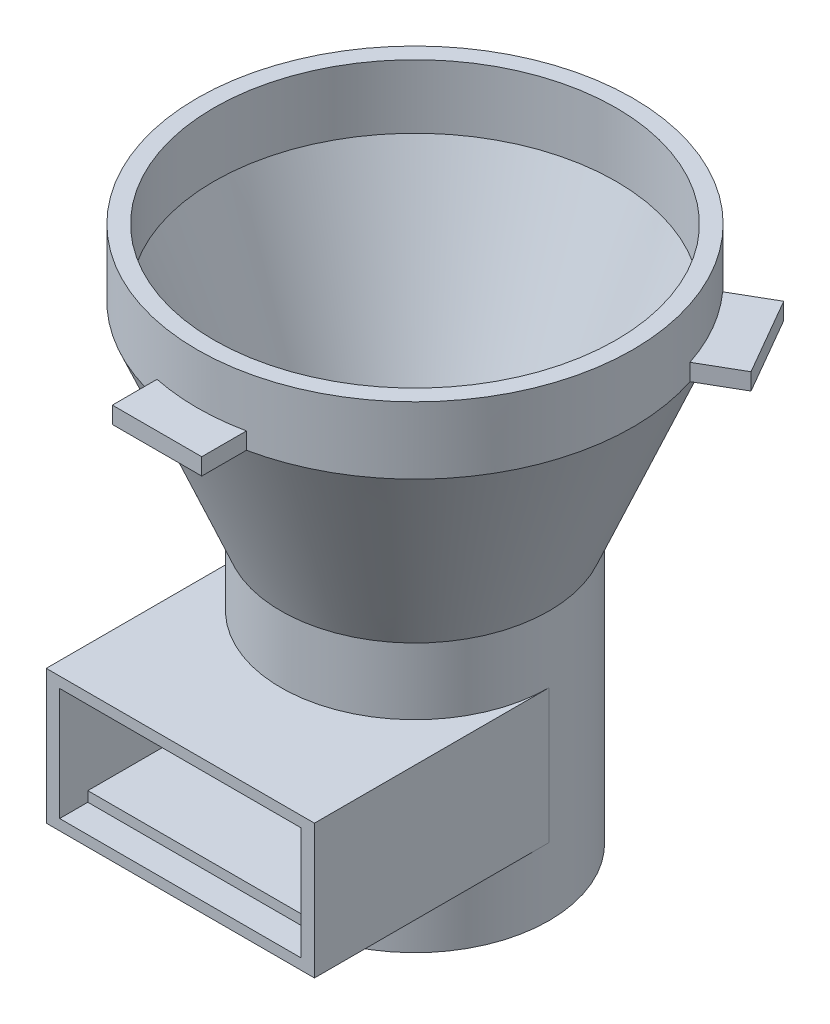
ISO-10303-21;
HEADER;
FILE_DESCRIPTION(('STEP AP214'),'2;1');
FILE_NAME('part.step','',(''),(''),'','','');
FILE_SCHEMA(('AUTOMOTIVE_DESIGN { 1 0 10303 214 1 1 1 1 }'));
ENDSEC;
DATA;
#1=APPLICATION_CONTEXT('core data for automotive mechanical design processes');
#2=APPLICATION_PROTOCOL_DEFINITION('international standard','automotive_design',2000,#1);
#3=PRODUCT_CONTEXT('',#1,'mechanical');
#4=PRODUCT('Part','Part','',(#3));
#5=PRODUCT_RELATED_PRODUCT_CATEGORY('part','',(#4));
#6=PRODUCT_DEFINITION_FORMATION('','',#4);
#7=PRODUCT_DEFINITION_CONTEXT('part definition',#1,'design');
#8=PRODUCT_DEFINITION('design','',#6,#7);
#9=PRODUCT_DEFINITION_SHAPE('','',#8);
#10=(LENGTH_UNIT() NAMED_UNIT(*) SI_UNIT(.MILLI.,.METRE.));
#11=(NAMED_UNIT(*) PLANE_ANGLE_UNIT() SI_UNIT($,.RADIAN.));
#12=(NAMED_UNIT(*) SI_UNIT($,.STERADIAN.) SOLID_ANGLE_UNIT());
#13=UNCERTAINTY_MEASURE_WITH_UNIT(LENGTH_MEASURE(1.E-05),#10,'distance_accuracy_value','');
#14=(GEOMETRIC_REPRESENTATION_CONTEXT(3) GLOBAL_UNCERTAINTY_ASSIGNED_CONTEXT((#13)) GLOBAL_UNIT_ASSIGNED_CONTEXT((#10,
#11,#12)) REPRESENTATION_CONTEXT('',''));
#15=CARTESIAN_POINT('',(0.,0.,0.));
#16=DIRECTION('',(0.,0.,1.));
#17=DIRECTION('',(1.,0.,0.));
#18=AXIS2_PLACEMENT_3D('',#15,#16,#17);
#19=CARTESIAN_POINT('',(0.,92.075,0.));
#20=DIRECTION('',(0.,-1.,0.));
#21=DIRECTION('',(1.,0.,0.));
#22=AXIS2_PLACEMENT_3D('',#19,#20,#21);
#23=PLANE('',#22);
#24=CARTESIAN_POINT('',(0.,92.075,0.));
#25=DIRECTION('',(0.,1.,0.));
#26=DIRECTION('',(-1.,0.,0.));
#27=AXIS2_PLACEMENT_3D('',#24,#25,#26);
#28=CIRCLE('',#27,41.275);
#29=CARTESIAN_POINT('',(-8.46666666666669,92.075,40.3972917477837));
#30=VERTEX_POINT('',#29);
#31=CARTESIAN_POINT('',(8.46666666666665,92.075,40.3972917477837));
#32=VERTEX_POINT('',#31);
#33=EDGE_CURVE('E54',#30,#32,#28,.T.);
#34=ORIENTED_EDGE('',*,*,#33,.F.);
#35=DIRECTION('',(0.,0.,1.));
#36=VECTOR('',#35,1.);
#37=CARTESIAN_POINT('',(-8.46666666666669,92.075,48.8639584144504));
#38=LINE('',#37,#36);
#39=CARTESIAN_POINT('',(-8.46666666666669,92.075,48.8639584144504));
#40=VERTEX_POINT('',#39);
#41=EDGE_CURVE('E208',#30,#40,#38,.T.);
#42=ORIENTED_EDGE('',*,*,#41,.T.);
#43=DIRECTION('',(1.,0.,0.));
#44=VECTOR('',#43,1.);
#45=CARTESIAN_POINT('',(0.,92.075,48.8639584144504));
#46=LINE('',#45,#44);
#47=CARTESIAN_POINT('',(8.46666666666665,92.075,48.8639584144504));
#48=VERTEX_POINT('',#47);
#49=EDGE_CURVE('E228',#40,#48,#46,.T.);
#50=ORIENTED_EDGE('',*,*,#49,.T.);
#51=DIRECTION('',(0.,0.,-1.));
#52=VECTOR('',#51,1.);
#53=CARTESIAN_POINT('',(8.46666666666665,92.075,48.8639584144504));
#54=LINE('',#53,#52);
#55=EDGE_CURVE('E211',#48,#32,#54,.T.);
#56=ORIENTED_EDGE('',*,*,#55,.T.);
#57=EDGE_LOOP('',(#34,#42,#50,#56));
#58=FACE_BOUND('',#57,.T.);
#59=ADVANCED_FACE('F43',(#58),#23,.F.);
#60=CARTESIAN_POINT('',(39.2184142310056,92.075,-12.8662974551833));
#61=VERTEX_POINT('',#60);
#62=CARTESIAN_POINT('',(30.7517475643391,92.075,-27.5309942925998));
#63=VERTEX_POINT('',#62);
#64=EDGE_CURVE('E11',#61,#63,#28,.T.);
#65=ORIENTED_EDGE('',*,*,#64,.F.);
#66=DIRECTION('',(0.866025403784443,0.,-0.499999999999992));
#67=VECTOR('',#66,1.);
#68=CARTESIAN_POINT('',(46.5507626497139,92.075,-17.0996307885165));
#69=LINE('',#68,#67);
#70=CARTESIAN_POINT('',(46.5507626497139,92.075,-17.0996307885165));
#71=VERTEX_POINT('',#70);
#72=EDGE_CURVE('E425',#61,#71,#69,.T.);
#73=ORIENTED_EDGE('',*,*,#72,.T.);
#74=DIRECTION('',(-0.499999999999992,0.,-0.866025403784443));
#75=VECTOR('',#74,1.);
#76=CARTESIAN_POINT('',(42.3174293163806,92.075,-24.4319792072248));
#77=LINE('',#76,#75);
#78=CARTESIAN_POINT('',(38.0840959830474,92.075,-31.7643276259331));
#79=VERTEX_POINT('',#78);
#80=EDGE_CURVE('E409',#71,#79,#77,.T.);
#81=ORIENTED_EDGE('',*,*,#80,.T.);
#82=DIRECTION('',(-0.866025403784443,0.,0.499999999999992));
#83=VECTOR('',#82,1.);
#84=CARTESIAN_POINT('',(38.0840959830474,92.075,-31.7643276259331));
#85=LINE('',#84,#83);
#86=EDGE_CURVE('E403',#79,#63,#85,.T.);
#87=ORIENTED_EDGE('',*,*,#86,.T.);
#88=EDGE_LOOP('',(#65,#73,#81,#87));
#89=FACE_BOUND('',#88,.T.);
#90=ADVANCED_FACE('F520',(#89),#23,.F.);
#91=CARTESIAN_POINT('',(-30.7517475643387,92.075,-27.5309942926003));
#92=VERTEX_POINT('',#91);
#93=CARTESIAN_POINT('',(-39.2184142310055,92.075,-12.8662974551838));
#94=VERTEX_POINT('',#93);
#95=EDGE_CURVE('E52',#92,#94,#28,.T.);
#96=ORIENTED_EDGE('',*,*,#95,.F.);
#97=DIRECTION('',(-0.866025403784436,0.,-0.500000000000004));
#98=VECTOR('',#97,1.);
#99=CARTESIAN_POINT('',(-38.084095983047,92.075,-31.7643276259336));
#100=LINE('',#99,#98);
#101=CARTESIAN_POINT('',(-38.084095983047,92.075,-31.7643276259336));
#102=VERTEX_POINT('',#101);
#103=EDGE_CURVE('E467',#92,#102,#100,.T.);
#104=ORIENTED_EDGE('',*,*,#103,.T.);
#105=DIRECTION('',(-0.500000000000004,0.,0.866025403784436));
#106=VECTOR('',#105,1.);
#107=CARTESIAN_POINT('',(-42.3174293163803,92.075,-24.4319792072254));
#108=LINE('',#107,#106);
#109=CARTESIAN_POINT('',(-46.5507626497137,92.075,-17.0996307885172));
#110=VERTEX_POINT('',#109);
#111=EDGE_CURVE('E451',#102,#110,#108,.T.);
#112=ORIENTED_EDGE('',*,*,#111,.T.);
#113=DIRECTION('',(0.866025403784436,0.,0.500000000000004));
#114=VECTOR('',#113,1.);
#115=CARTESIAN_POINT('',(-46.5507626497137,92.075,-17.0996307885172));
#116=LINE('',#115,#114);
#117=EDGE_CURVE('E434',#110,#94,#116,.T.);
#118=ORIENTED_EDGE('',*,*,#117,.T.);
#119=EDGE_LOOP('',(#96,#104,#112,#118));
#120=FACE_BOUND('',#119,.T.);
#121=ADVANCED_FACE('F540',(#120),#23,.F.);
#122=CARTESIAN_POINT('',(22.86,14.8525001339576,3.68300000000003));
#123=DIRECTION('',(1.,0.,0.));
#124=DIRECTION('',(0.,0.,-1.));
#125=AXIS2_PLACEMENT_3D('',#122,#123,#124);
#126=PLANE('',#125);
#127=DIRECTION('',(0.,0.,1.));
#128=VECTOR('',#127,1.);
#129=CARTESIAN_POINT('',(22.86,16.7575001339576,3.68300000000003));
#130=LINE('',#129,#128);
#131=CARTESIAN_POINT('',(22.86,16.7575001339576,3.68300000000003));
#132=VERTEX_POINT('',#131);
#133=CARTESIAN_POINT('',(22.86,16.7575001339576,39.1163527750558));
#134=VERTEX_POINT('',#133);
#135=EDGE_CURVE('E316',#132,#134,#130,.T.);
#136=ORIENTED_EDGE('',*,*,#135,.T.);
#137=DIRECTION('',(0.,1.,0.));
#138=VECTOR('',#137,1.);
#139=CARTESIAN_POINT('',(22.86,16.7575001339576,39.1163527750558));
#140=LINE('',#139,#138);
#141=CARTESIAN_POINT('',(22.86,14.8525001339576,39.1163527750558));
#142=VERTEX_POINT('',#141);
#143=EDGE_CURVE('E299',#142,#134,#140,.T.);
#144=ORIENTED_EDGE('',*,*,#143,.F.);
#145=DIRECTION('',(0.,0.,1.));
#146=VECTOR('',#145,1.);
#147=CARTESIAN_POINT('',(22.86,14.8525001339576,3.68300000000003));
#148=LINE('',#147,#146);
#149=CARTESIAN_POINT('',(22.86,14.8525001339576,44.45));
#150=VERTEX_POINT('',#149);
#151=EDGE_CURVE('E344',#142,#150,#148,.T.);
#152=ORIENTED_EDGE('',*,*,#151,.T.);
#153=DIRECTION('',(0.,1.,0.));
#154=VECTOR('',#153,1.);
#155=CARTESIAN_POINT('',(22.86,14.8525001339576,44.45));
#156=LINE('',#155,#154);
#157=CARTESIAN_POINT('',(22.86,36.1885001339576,44.45));
#158=VERTEX_POINT('',#157);
#159=EDGE_CURVE('E69',#150,#158,#156,.T.);
#160=ORIENTED_EDGE('',*,*,#159,.T.);
#161=DIRECTION('',(0.,0.,1.));
#162=VECTOR('',#161,1.);
#163=CARTESIAN_POINT('',(22.86,36.1885001339576,3.68300000000003));
#164=LINE('',#163,#162);
#165=CARTESIAN_POINT('',(22.86,36.1885001339576,3.68300000000003));
#166=VERTEX_POINT('',#165);
#167=EDGE_CURVE('E330',#166,#158,#164,.T.);
#168=ORIENTED_EDGE('',*,*,#167,.F.);
#169=DIRECTION('',(0.,1.,0.));
#170=VECTOR('',#169,1.);
#171=CARTESIAN_POINT('',(22.86,14.8525001339576,3.68300000000003));
#172=LINE('',#171,#170);
#173=EDGE_CURVE('E319',#132,#166,#172,.T.);
#174=ORIENTED_EDGE('',*,*,#173,.F.);
#175=EDGE_LOOP('',(#136,#144,#152,#160,#168,#174));
#176=FACE_BOUND('',#175,.T.);
#177=ADVANCED_FACE('F545',(#176),#126,.F.);
#178=CARTESIAN_POINT('',(-22.86,14.8525001339576,3.68300000000003));
#179=DIRECTION('',(-1.,0.,0.));
#180=DIRECTION('',(0.,0.,1.));
#181=AXIS2_PLACEMENT_3D('',#178,#179,#180);
#182=PLANE('',#181);
#183=DIRECTION('',(0.,-1.,0.));
#184=VECTOR('',#183,1.);
#185=CARTESIAN_POINT('',(-22.86,16.7575001339576,39.1163527750558));
#186=LINE('',#185,#184);
#187=CARTESIAN_POINT('',(-22.86,16.7575001339576,39.1163527750558));
#188=VERTEX_POINT('',#187);
#189=CARTESIAN_POINT('',(-22.86,14.8525001339576,39.1163527750558));
#190=VERTEX_POINT('',#189);
#191=EDGE_CURVE('E293',#188,#190,#186,.T.);
#192=ORIENTED_EDGE('',*,*,#191,.F.);
#193=DIRECTION('',(0.,0.,-1.));
#194=VECTOR('',#193,1.);
#195=CARTESIAN_POINT('',(-22.86,16.7575001339576,3.68300000000003));
#196=LINE('',#195,#194);
#197=CARTESIAN_POINT('',(-22.86,16.7575001339576,3.68300000000003));
#198=VERTEX_POINT('',#197);
#199=EDGE_CURVE('E312',#188,#198,#196,.T.);
#200=ORIENTED_EDGE('',*,*,#199,.T.);
#201=DIRECTION('',(0.,-1.,0.));
#202=VECTOR('',#201,1.);
#203=CARTESIAN_POINT('',(-22.86,14.8525001339576,3.68300000000003));
#204=LINE('',#203,#202);
#205=CARTESIAN_POINT('',(-22.86,36.1885001339576,3.68300000000003));
#206=VERTEX_POINT('',#205);
#207=EDGE_CURVE('E327',#206,#198,#204,.T.);
#208=ORIENTED_EDGE('',*,*,#207,.F.);
#209=DIRECTION('',(0.,0.,1.));
#210=VECTOR('',#209,1.);
#211=CARTESIAN_POINT('',(-22.86,36.1885001339576,3.68300000000003));
#212=LINE('',#211,#210);
#213=CARTESIAN_POINT('',(-22.86,36.1885001339576,44.45));
#214=VERTEX_POINT('',#213);
#215=EDGE_CURVE('E351',#206,#214,#212,.T.);
#216=ORIENTED_EDGE('',*,*,#215,.T.);
#217=DIRECTION('',(0.,-1.,0.));
#218=VECTOR('',#217,1.);
#219=CARTESIAN_POINT('',(-22.86,14.8525001339576,44.45));
#220=LINE('',#219,#218);
#221=CARTESIAN_POINT('',(-22.86,14.8525001339576,44.45));
#222=VERTEX_POINT('',#221);
#223=EDGE_CURVE('E337',#214,#222,#220,.T.);
#224=ORIENTED_EDGE('',*,*,#223,.T.);
#225=DIRECTION('',(0.,0.,1.));
#226=VECTOR('',#225,1.);
#227=CARTESIAN_POINT('',(-22.86,14.8525001339576,3.68300000000003));
#228=LINE('',#227,#226);
#229=EDGE_CURVE('E348',#190,#222,#228,.T.);
#230=ORIENTED_EDGE('',*,*,#229,.F.);
#231=EDGE_LOOP('',(#192,#200,#208,#216,#224,#230));
#232=FACE_BOUND('',#231,.T.);
#233=ADVANCED_FACE('F550',(#232),#182,.F.);
#234=CARTESIAN_POINT('',(-22.86,14.8525001339576,3.68300000000003));
#235=DIRECTION('',(0.,-1.,0.));
#236=DIRECTION('',(0.,0.,-1.));
#237=AXIS2_PLACEMENT_3D('',#234,#235,#236);
#238=PLANE('',#237);
#239=ORIENTED_EDGE('',*,*,#151,.F.);
#240=DIRECTION('',(1.,0.,0.));
#241=VECTOR('',#240,1.);
#242=CARTESIAN_POINT('',(-22.86,14.8525001339576,39.1163527750558));
#243=LINE('',#242,#241);
#244=EDGE_CURVE('E296',#190,#142,#243,.T.);
#245=ORIENTED_EDGE('',*,*,#244,.F.);
#246=ORIENTED_EDGE('',*,*,#229,.T.);
#247=DIRECTION('',(1.,0.,0.));
#248=VECTOR('',#247,1.);
#249=CARTESIAN_POINT('',(-22.86,14.8525001339576,44.45));
#250=LINE('',#249,#248);
#251=EDGE_CURVE('E323',#222,#150,#250,.T.);
#252=ORIENTED_EDGE('',*,*,#251,.T.);
#253=EDGE_LOOP('',(#239,#245,#246,#252));
#254=FACE_BOUND('',#253,.T.);
#255=ADVANCED_FACE('F601',(#254),#238,.F.);
#256=CARTESIAN_POINT('',(0.,0.,0.));
#257=DIRECTION('',(0.,-1.,0.));
#258=DIRECTION('',(1.,0.,0.));
#259=AXIS2_PLACEMENT_3D('',#256,#257,#258);
#260=CYLINDRICAL_SURFACE('',#259,25.4);
#261=CARTESIAN_POINT('',(0.,50.8,0.));
#262=DIRECTION('',(0.,-1.,0.));
#263=DIRECTION('',(1.,0.,0.));
#264=AXIS2_PLACEMENT_3D('',#261,#262,#263);
#265=CIRCLE('',#264,25.4);
#266=CARTESIAN_POINT('',(25.4,50.8,0.));
#267=VERTEX_POINT('',#266);
#268=EDGE_CURVE('E266',#267,#267,#265,.T.);
#269=ORIENTED_EDGE('',*,*,#268,.T.);
#270=EDGE_LOOP('',(#269));
#271=FACE_BOUND('',#270,.T.);
#272=CARTESIAN_POINT('',(0.,0.,0.));
#273=DIRECTION('',(0.,-1.,0.));
#274=DIRECTION('',(1.,0.,0.));
#275=AXIS2_PLACEMENT_3D('',#272,#273,#274);
#276=CIRCLE('',#275,25.4);
#277=CARTESIAN_POINT('',(25.4,0.,0.));
#278=VERTEX_POINT('',#277);
#279=EDGE_CURVE('E255',#278,#278,#276,.T.);
#280=ORIENTED_EDGE('',*,*,#279,.F.);
#281=EDGE_LOOP('',(#280));
#282=FACE_BOUND('',#281,.T.);
#283=CARTESIAN_POINT('',(0.,12.8205001339576,0.));
#284=DIRECTION('',(0.,1.,0.));
#285=DIRECTION('',(0.,0.,1.));
#286=AXIS2_PLACEMENT_3D('',#283,#284,#285);
#287=CIRCLE('',#286,25.4);
#288=CARTESIAN_POINT('',(-25.4,12.8205001339576,0.));
#289=VERTEX_POINT('',#288);
#290=CARTESIAN_POINT('',(25.4,12.8205001339576,0.));
#291=VERTEX_POINT('',#290);
#292=EDGE_CURVE('E399',#289,#291,#287,.T.);
#293=ORIENTED_EDGE('',*,*,#292,.F.);
#294=DIRECTION('',(0.,-1.,0.));
#295=VECTOR('',#294,1.);
#296=CARTESIAN_POINT('',(-25.4,38.2205001339576,0.));
#297=LINE('',#296,#295);
#298=CARTESIAN_POINT('',(-25.4,38.2205001339576,0.));
#299=VERTEX_POINT('',#298);
#300=EDGE_CURVE('E358',#299,#289,#297,.T.);
#301=ORIENTED_EDGE('',*,*,#300,.F.);
#302=CARTESIAN_POINT('',(0.,38.2205001339576,0.));
#303=DIRECTION('',(0.,-1.,0.));
#304=DIRECTION('',(0.,0.,-1.));
#305=AXIS2_PLACEMENT_3D('',#302,#303,#304);
#306=CIRCLE('',#305,25.4);
#307=CARTESIAN_POINT('',(25.4,38.2205001339576,0.));
#308=VERTEX_POINT('',#307);
#309=EDGE_CURVE('E395',#308,#299,#306,.T.);
#310=ORIENTED_EDGE('',*,*,#309,.F.);
#311=DIRECTION('',(0.,1.,0.));
#312=VECTOR('',#311,1.);
#313=CARTESIAN_POINT('',(25.4,38.2205001339576,0.));
#314=LINE('',#313,#312);
#315=EDGE_CURVE('E364',#291,#308,#314,.T.);
#316=ORIENTED_EDGE('',*,*,#315,.F.);
#317=EDGE_LOOP('',(#293,#301,#310,#316));
#318=FACE_BOUND('',#317,.T.);
#319=ADVANCED_FACE('F594',(#271,#282,#318),#260,.T.);
#320=CARTESIAN_POINT('',(0.,0.,0.));
#321=DIRECTION('',(0.,-1.,0.));
#322=DIRECTION('',(1.,0.,0.));
#323=AXIS2_PLACEMENT_3D('',#320,#321,#322);
#324=CYLINDRICAL_SURFACE('',#323,22.225);
#325=DIRECTION('',(0.,-1.,0.));
#326=VECTOR('',#325,1.);
#327=CARTESIAN_POINT('',(-21.9177128368815,0.,3.68300000000003));
#328=LINE('',#327,#326);
#329=CARTESIAN_POINT('',(-21.9177128368815,16.7575001339576,3.68300000000003));
#330=VERTEX_POINT('',#329);
#331=CARTESIAN_POINT('',(-21.9177128368815,36.1885001339576,3.68300000000003));
#332=VERTEX_POINT('',#331);
#333=EDGE_CURVE('E274',#330,#332,#328,.F.);
#334=ORIENTED_EDGE('',*,*,#333,.F.);
#335=CARTESIAN_POINT('',(0.,16.7575001339576,0.));
#336=DIRECTION('',(0.,-1.,0.));
#337=DIRECTION('',(0.,0.,1.));
#338=AXIS2_PLACEMENT_3D('',#335,#336,#337);
#339=CIRCLE('',#338,22.225);
#340=CARTESIAN_POINT('',(21.9177128368815,16.7575001339576,3.68300000000003));
#341=VERTEX_POINT('',#340);
#342=EDGE_CURVE('E61',#341,#330,#339,.T.);
#343=ORIENTED_EDGE('',*,*,#342,.F.);
#344=DIRECTION('',(0.,-1.,0.));
#345=VECTOR('',#344,1.);
#346=CARTESIAN_POINT('',(21.9177128368815,0.,3.68300000000003));
#347=LINE('',#346,#345);
#348=CARTESIAN_POINT('',(21.9177128368815,36.1885001339576,3.68300000000003));
#349=VERTEX_POINT('',#348);
#350=EDGE_CURVE('E276',#349,#341,#347,.T.);
#351=ORIENTED_EDGE('',*,*,#350,.F.);
#352=CARTESIAN_POINT('',(0.,36.1885001339576,0.));
#353=DIRECTION('',(0.,1.,0.));
#354=DIRECTION('',(0.,0.,1.));
#355=AXIS2_PLACEMENT_3D('',#352,#353,#354);
#356=CIRCLE('',#355,22.225);
#357=EDGE_CURVE('E347',#332,#349,#356,.T.);
#358=ORIENTED_EDGE('',*,*,#357,.F.);
#359=EDGE_LOOP('',(#334,#343,#351,#358));
#360=FACE_BOUND('',#359,.T.);
#361=CARTESIAN_POINT('',(0.,0.,0.));
#362=DIRECTION('',(0.,1.,0.));
#363=DIRECTION('',(-1.,0.,0.));
#364=AXIS2_PLACEMENT_3D('',#361,#362,#363);
#365=CIRCLE('',#364,22.225);
#366=CARTESIAN_POINT('',(-22.225,0.,0.));
#367=VERTEX_POINT('',#366);
#368=EDGE_CURVE('E241',#367,#367,#365,.F.);
#369=ORIENTED_EDGE('',*,*,#368,.T.);
#370=EDGE_LOOP('',(#369));
#371=FACE_BOUND('',#370,.T.);
#372=CARTESIAN_POINT('',(0.,51.435,0.));
#373=DIRECTION('',(0.,1.,0.));
#374=DIRECTION('',(-1.,0.,0.));
#375=AXIS2_PLACEMENT_3D('',#372,#373,#374);
#376=CIRCLE('',#375,22.225);
#377=CARTESIAN_POINT('',(-22.225,51.435,0.));
#378=VERTEX_POINT('',#377);
#379=EDGE_CURVE('E256',#378,#378,#376,.F.);
#380=ORIENTED_EDGE('',*,*,#379,.F.);
#381=EDGE_LOOP('',(#380));
#382=FACE_BOUND('',#381,.T.);
#383=ADVANCED_FACE('F591',(#360,#371,#382),#324,.F.);
#384=CARTESIAN_POINT('',(0.,0.,0.));
#385=DIRECTION('',(0.,-1.,0.));
#386=DIRECTION('',(1.,0.,0.));
#387=AXIS2_PLACEMENT_3D('',#384,#385,#386);
#388=CYLINDRICAL_SURFACE('',#387,41.275);
#389=DIRECTION('',(0.,1.,0.));
#390=VECTOR('',#389,1.);
#391=CARTESIAN_POINT('',(-8.46666666666669,88.9,40.3972917477837));
#392=LINE('',#391,#390);
#393=CARTESIAN_POINT('',(-8.46666666666669,88.9,40.3972917477837));
#394=VERTEX_POINT('',#393);
#395=EDGE_CURVE('E223',#394,#30,#392,.T.);
#396=ORIENTED_EDGE('',*,*,#395,.T.);
#397=ORIENTED_EDGE('',*,*,#33,.T.);
#398=DIRECTION('',(0.,1.,0.));
#399=VECTOR('',#398,1.);
#400=CARTESIAN_POINT('',(8.46666666666664,88.9,40.3972917477837));
#401=LINE('',#400,#399);
#402=CARTESIAN_POINT('',(8.46666666666664,88.9,40.3972917477837));
#403=VERTEX_POINT('',#402);
#404=EDGE_CURVE('E237',#403,#32,#401,.T.);
#405=ORIENTED_EDGE('',*,*,#404,.F.);
#406=CARTESIAN_POINT('',(0.,88.9,0.));
#407=DIRECTION('',(0.,-1.,0.));
#408=DIRECTION('',(1.,0.,0.));
#409=AXIS2_PLACEMENT_3D('',#406,#407,#408);
#410=CIRCLE('',#409,41.275);
#411=CARTESIAN_POINT('',(39.2184142310056,88.9,-12.8662974551833));
#412=VERTEX_POINT('',#411);
#413=EDGE_CURVE('E270',#412,#403,#410,.T.);
#414=ORIENTED_EDGE('',*,*,#413,.F.);
#415=DIRECTION('',(0.,1.,0.));
#416=VECTOR('',#415,1.);
#417=CARTESIAN_POINT('',(39.2184142310056,88.9,-12.8662974551833));
#418=LINE('',#417,#416);
#419=EDGE_CURVE('E435',#412,#61,#418,.T.);
#420=ORIENTED_EDGE('',*,*,#419,.T.);
#421=ORIENTED_EDGE('',*,*,#64,.T.);
#422=DIRECTION('',(0.,1.,0.));
#423=VECTOR('',#422,1.);
#424=CARTESIAN_POINT('',(30.7517475643391,88.9,-27.5309942925998));
#425=LINE('',#424,#423);
#426=CARTESIAN_POINT('',(30.7517475643391,88.9,-27.5309942925998));
#427=VERTEX_POINT('',#426);
#428=EDGE_CURVE('E439',#427,#63,#425,.T.);
#429=ORIENTED_EDGE('',*,*,#428,.F.);
#430=CARTESIAN_POINT('',(-30.7517475643387,88.9,-27.5309942926003));
#431=VERTEX_POINT('',#430);
#432=EDGE_CURVE('E507',#431,#427,#410,.T.);
#433=ORIENTED_EDGE('',*,*,#432,.F.);
#434=DIRECTION('',(0.,1.,0.));
#435=VECTOR('',#434,1.);
#436=CARTESIAN_POINT('',(-30.7517475643387,88.9,-27.5309942926003));
#437=LINE('',#436,#435);
#438=EDGE_CURVE('E476',#431,#92,#437,.T.);
#439=ORIENTED_EDGE('',*,*,#438,.T.);
#440=ORIENTED_EDGE('',*,*,#95,.T.);
#441=DIRECTION('',(0.,1.,0.));
#442=VECTOR('',#441,1.);
#443=CARTESIAN_POINT('',(-39.2184142310055,88.9,-12.8662974551838));
#444=LINE('',#443,#442);
#445=CARTESIAN_POINT('',(-39.2184142310055,88.9,-12.8662974551838));
#446=VERTEX_POINT('',#445);
#447=EDGE_CURVE('E479',#446,#94,#444,.T.);
#448=ORIENTED_EDGE('',*,*,#447,.F.);
#449=EDGE_CURVE('E234',#394,#446,#410,.T.);
#450=ORIENTED_EDGE('',*,*,#449,.F.);
#451=EDGE_LOOP('',(#396,#397,#405,#414,#420,#421,#429,#433,#439,#440,#448,#450));
#452=FACE_BOUND('',#451,.T.);
#453=CARTESIAN_POINT('',(0.,101.6,0.));
#454=DIRECTION('',(0.,1.,0.));
#455=DIRECTION('',(-1.,0.,0.));
#456=AXIS2_PLACEMENT_3D('',#453,#454,#455);
#457=CIRCLE('',#456,41.275);
#458=CARTESIAN_POINT('',(-41.275,101.6,0.));
#459=VERTEX_POINT('',#458);
#460=EDGE_CURVE('E217',#459,#459,#457,.T.);
#461=ORIENTED_EDGE('',*,*,#460,.F.);
#462=EDGE_LOOP('',(#461));
#463=FACE_BOUND('',#462,.T.);
#464=ADVANCED_FACE('F230',(#452,#463),#388,.T.);
#465=CARTESIAN_POINT('',(0.,88.9,0.));
#466=DIRECTION('',(0.,1.,0.));
#467=DIRECTION('',(-1.,0.,0.));
#468=AXIS2_PLACEMENT_3D('',#465,#466,#467);
#469=CONICAL_SURFACE('',#468,41.275,0.394791119699761);
#470=ORIENTED_EDGE('',*,*,#268,.F.);
#471=EDGE_LOOP('',(#470));
#472=FACE_BOUND('',#471,.T.);
#473=EDGE_CURVE('E271',#403,#394,#410,.T.);
#474=ORIENTED_EDGE('',*,*,#473,.T.);
#475=ORIENTED_EDGE('',*,*,#449,.T.);
#476=CARTESIAN_POINT('',(0.,88.9,0.));
#477=DIRECTION('',(0.,-1.,0.));
#478=DIRECTION('',(0.500000000000004,0.,-0.866025403784436));
#479=AXIS2_PLACEMENT_3D('',#476,#477,#478);
#480=CIRCLE('',#479,41.275);
#481=EDGE_CURVE('E455',#446,#431,#480,.T.);
#482=ORIENTED_EDGE('',*,*,#481,.T.);
#483=ORIENTED_EDGE('',*,*,#432,.T.);
#484=CARTESIAN_POINT('',(0.,88.9,0.));
#485=DIRECTION('',(0.,-1.,0.));
#486=DIRECTION('',(0.499999999999992,0.,0.866025403784443));
#487=AXIS2_PLACEMENT_3D('',#484,#485,#486);
#488=CIRCLE('',#487,41.275);
#489=EDGE_CURVE('E413',#427,#412,#488,.T.);
#490=ORIENTED_EDGE('',*,*,#489,.T.);
#491=ORIENTED_EDGE('',*,*,#413,.T.);
#492=EDGE_LOOP('',(#474,#475,#482,#483,#490,#491));
#493=FACE_BOUND('',#492,.T.);
#494=ADVANCED_FACE('F509',(#472,#493),#469,.T.);
#495=CARTESIAN_POINT('',(-25.4,0.,0.));
#496=DIRECTION('',(0.,1.,0.));
#497=DIRECTION('',(-1.,0.,0.));
#498=AXIS2_PLACEMENT_3D('',#495,#496,#497);
#499=PLANE('',#498);
#500=ORIENTED_EDGE('',*,*,#368,.F.);
#501=EDGE_LOOP('',(#500));
#502=FACE_BOUND('',#501,.T.);
#503=ORIENTED_EDGE('',*,*,#279,.T.);
#504=EDGE_LOOP('',(#503));
#505=FACE_BOUND('',#504,.T.);
#506=ADVANCED_FACE('F586',(#502,#505),#499,.F.);
#507=CARTESIAN_POINT('',(0.,0.,0.));
#508=DIRECTION('',(0.,-1.,0.));
#509=DIRECTION('',(1.,0.,0.));
#510=AXIS2_PLACEMENT_3D('',#507,#508,#509);
#511=CYLINDRICAL_SURFACE('',#510,38.1);
#512=CARTESIAN_POINT('',(0.,89.535,0.));
#513=DIRECTION('',(0.,1.,0.));
#514=DIRECTION('',(-1.,0.,0.));
#515=AXIS2_PLACEMENT_3D('',#512,#513,#514);
#516=CIRCLE('',#515,38.1);
#517=CARTESIAN_POINT('',(-38.1,89.535,0.));
#518=VERTEX_POINT('',#517);
#519=EDGE_CURVE('E251',#518,#518,#516,.F.);
#520=ORIENTED_EDGE('',*,*,#519,.T.);
#521=EDGE_LOOP('',(#520));
#522=FACE_BOUND('',#521,.T.);
#523=CARTESIAN_POINT('',(0.,101.6,0.));
#524=DIRECTION('',(0.,1.,0.));
#525=DIRECTION('',(-1.,0.,0.));
#526=AXIS2_PLACEMENT_3D('',#523,#524,#525);
#527=CIRCLE('',#526,38.1);
#528=CARTESIAN_POINT('',(-38.1,101.6,0.));
#529=VERTEX_POINT('',#528);
#530=EDGE_CURVE('E218',#529,#529,#527,.T.);
#531=ORIENTED_EDGE('',*,*,#530,.T.);
#532=EDGE_LOOP('',(#531));
#533=FACE_BOUND('',#532,.T.);
#534=ADVANCED_FACE('F583',(#522,#533),#511,.F.);
#535=CARTESIAN_POINT('',(0.,90.1211538461539,0.));
#536=DIRECTION('',(0.,1.,0.));
#537=DIRECTION('',(-1.,0.,0.));
#538=AXIS2_PLACEMENT_3D('',#535,#536,#537);
#539=CONICAL_SURFACE('',#538,38.3442307692308,0.394791119699761);
#540=ORIENTED_EDGE('',*,*,#379,.T.);
#541=EDGE_LOOP('',(#540));
#542=FACE_BOUND('',#541,.T.);
#543=ORIENTED_EDGE('',*,*,#519,.F.);
#544=EDGE_LOOP('',(#543));
#545=FACE_BOUND('',#544,.T.);
#546=ADVANCED_FACE('F580',(#542,#545),#539,.F.);
#547=CARTESIAN_POINT('',(0.,88.9,48.8639584144504));
#548=DIRECTION('',(0.,0.,1.));
#549=DIRECTION('',(1.,0.,0.));
#550=AXIS2_PLACEMENT_3D('',#547,#548,#549);
#551=PLANE('',#550);
#552=ORIENTED_EDGE('',*,*,#49,.F.);
#553=DIRECTION('',(0.,1.,0.));
#554=VECTOR('',#553,1.);
#555=CARTESIAN_POINT('',(-8.46666666666669,88.9,48.8639584144504));
#556=LINE('',#555,#554);
#557=CARTESIAN_POINT('',(-8.46666666666669,88.9,48.8639584144504));
#558=VERTEX_POINT('',#557);
#559=EDGE_CURVE('E226',#558,#40,#556,.T.);
#560=ORIENTED_EDGE('',*,*,#559,.F.);
#561=DIRECTION('',(1.,0.,0.));
#562=VECTOR('',#561,1.);
#563=CARTESIAN_POINT('',(0.,88.9,48.8639584144504));
#564=LINE('',#563,#562);
#565=CARTESIAN_POINT('',(8.46666666666665,88.9,48.8639584144504));
#566=VERTEX_POINT('',#565);
#567=EDGE_CURVE('E485',#558,#566,#564,.T.);
#568=ORIENTED_EDGE('',*,*,#567,.T.);
#569=DIRECTION('',(0.,1.,0.));
#570=VECTOR('',#569,1.);
#571=CARTESIAN_POINT('',(8.46666666666665,88.9,48.8639584144504));
#572=LINE('',#571,#570);
#573=EDGE_CURVE('E243',#566,#48,#572,.T.);
#574=ORIENTED_EDGE('',*,*,#573,.T.);
#575=EDGE_LOOP('',(#552,#560,#568,#574));
#576=FACE_BOUND('',#575,.T.);
#577=ADVANCED_FACE('F498',(#576),#551,.T.);
#578=CARTESIAN_POINT('',(-8.46666666666669,88.9,48.8639584144504));
#579=DIRECTION('',(-1.,0.,0.));
#580=DIRECTION('',(0.,-1.,0.));
#581=AXIS2_PLACEMENT_3D('',#578,#579,#580);
#582=PLANE('',#581);
#583=ORIENTED_EDGE('',*,*,#41,.F.);
#584=ORIENTED_EDGE('',*,*,#395,.F.);
#585=DIRECTION('',(0.,0.,1.));
#586=VECTOR('',#585,1.);
#587=CARTESIAN_POINT('',(-8.46666666666669,88.9,48.8639584144504));
#588=LINE('',#587,#586);
#589=EDGE_CURVE('E250',#394,#558,#588,.T.);
#590=ORIENTED_EDGE('',*,*,#589,.T.);
#591=ORIENTED_EDGE('',*,*,#559,.T.);
#592=EDGE_LOOP('',(#583,#584,#590,#591));
#593=FACE_BOUND('',#592,.T.);
#594=ADVANCED_FACE('F221',(#593),#582,.T.);
#595=CARTESIAN_POINT('',(8.46666666666665,88.9,48.8639584144504));
#596=DIRECTION('',(1.,0.,0.));
#597=DIRECTION('',(0.,1.,0.));
#598=AXIS2_PLACEMENT_3D('',#595,#596,#597);
#599=PLANE('',#598);
#600=ORIENTED_EDGE('',*,*,#55,.F.);
#601=ORIENTED_EDGE('',*,*,#573,.F.);
#602=DIRECTION('',(0.,0.,-1.));
#603=VECTOR('',#602,1.);
#604=CARTESIAN_POINT('',(8.46666666666665,88.9,48.8639584144504));
#605=LINE('',#604,#603);
#606=EDGE_CURVE('E489',#566,#403,#605,.T.);
#607=ORIENTED_EDGE('',*,*,#606,.T.);
#608=ORIENTED_EDGE('',*,*,#404,.T.);
#609=EDGE_LOOP('',(#600,#601,#607,#608));
#610=FACE_BOUND('',#609,.T.);
#611=ADVANCED_FACE('F501',(#610),#599,.T.);
#612=CARTESIAN_POINT('',(0.,88.9,0.));
#613=DIRECTION('',(0.,1.,0.));
#614=DIRECTION('',(-1.,0.,0.));
#615=AXIS2_PLACEMENT_3D('',#612,#613,#614);
#616=PLANE('',#615);
#617=ORIENTED_EDGE('',*,*,#567,.F.);
#618=ORIENTED_EDGE('',*,*,#589,.F.);
#619=ORIENTED_EDGE('',*,*,#473,.F.);
#620=ORIENTED_EDGE('',*,*,#606,.F.);
#621=EDGE_LOOP('',(#617,#618,#619,#620));
#622=FACE_BOUND('',#621,.T.);
#623=ADVANCED_FACE('F566',(#622),#616,.F.);
#624=CARTESIAN_POINT('',(-42.3174293163803,88.9,-24.4319792072254));
#625=DIRECTION('',(-0.866025403784436,0.,-0.500000000000004));
#626=DIRECTION('',(-0.500000000000004,0.,0.866025403784436));
#627=AXIS2_PLACEMENT_3D('',#624,#625,#626);
#628=PLANE('',#627);
#629=ORIENTED_EDGE('',*,*,#111,.F.);
#630=DIRECTION('',(0.,1.,0.));
#631=VECTOR('',#630,1.);
#632=CARTESIAN_POINT('',(-38.084095983047,88.9,-31.7643276259336));
#633=LINE('',#632,#631);
#634=CARTESIAN_POINT('',(-38.084095983047,88.9,-31.7643276259336));
#635=VERTEX_POINT('',#634);
#636=EDGE_CURVE('E473',#635,#102,#633,.T.);
#637=ORIENTED_EDGE('',*,*,#636,.F.);
#638=DIRECTION('',(-0.500000000000004,0.,0.866025403784436));
#639=VECTOR('',#638,1.);
#640=CARTESIAN_POINT('',(-42.3174293163803,88.9,-24.4319792072254));
#641=LINE('',#640,#639);
#642=CARTESIAN_POINT('',(-46.5507626497137,88.9,-17.0996307885172));
#643=VERTEX_POINT('',#642);
#644=EDGE_CURVE('E446',#635,#643,#641,.T.);
#645=ORIENTED_EDGE('',*,*,#644,.T.);
#646=DIRECTION('',(0.,1.,0.));
#647=VECTOR('',#646,1.);
#648=CARTESIAN_POINT('',(-46.5507626497137,88.9,-17.0996307885172));
#649=LINE('',#648,#647);
#650=EDGE_CURVE('E463',#643,#110,#649,.T.);
#651=ORIENTED_EDGE('',*,*,#650,.T.);
#652=EDGE_LOOP('',(#629,#637,#645,#651));
#653=FACE_BOUND('',#652,.T.);
#654=ADVANCED_FACE('F560',(#653),#628,.T.);
#655=CARTESIAN_POINT('',(-38.084095983047,88.9,-31.7643276259336));
#656=DIRECTION('',(0.500000000000004,0.,-0.866025403784436));
#657=DIRECTION('',(-0.866025403784436,0.,-0.500000000000004));
#658=AXIS2_PLACEMENT_3D('',#655,#656,#657);
#659=PLANE('',#658);
#660=ORIENTED_EDGE('',*,*,#103,.F.);
#661=ORIENTED_EDGE('',*,*,#438,.F.);
#662=DIRECTION('',(-0.866025403784436,0.,-0.500000000000004));
#663=VECTOR('',#662,1.);
#664=CARTESIAN_POINT('',(-38.084095983047,88.9,-31.7643276259336));
#665=LINE('',#664,#663);
#666=EDGE_CURVE('E459',#431,#635,#665,.T.);
#667=ORIENTED_EDGE('',*,*,#666,.T.);
#668=ORIENTED_EDGE('',*,*,#636,.T.);
#669=EDGE_LOOP('',(#660,#661,#667,#668));
#670=FACE_BOUND('',#669,.T.);
#671=ADVANCED_FACE('F557',(#670),#659,.T.);
#672=CARTESIAN_POINT('',(-46.5507626497137,88.9,-17.0996307885172));
#673=DIRECTION('',(-0.500000000000004,0.,0.866025403784436));
#674=DIRECTION('',(0.866025403784436,0.,0.500000000000004));
#675=AXIS2_PLACEMENT_3D('',#672,#673,#674);
#676=PLANE('',#675);
#677=ORIENTED_EDGE('',*,*,#117,.F.);
#678=ORIENTED_EDGE('',*,*,#650,.F.);
#679=DIRECTION('',(0.866025403784436,0.,0.500000000000004));
#680=VECTOR('',#679,1.);
#681=CARTESIAN_POINT('',(-46.5507626497137,88.9,-17.0996307885172));
#682=LINE('',#681,#680);
#683=EDGE_CURVE('E450',#643,#446,#682,.T.);
#684=ORIENTED_EDGE('',*,*,#683,.T.);
#685=ORIENTED_EDGE('',*,*,#447,.T.);
#686=EDGE_LOOP('',(#677,#678,#684,#685));
#687=FACE_BOUND('',#686,.T.);
#688=ADVANCED_FACE('F535',(#687),#676,.T.);
#689=CARTESIAN_POINT('',(0.,88.9,0.));
#690=DIRECTION('',(0.,1.,0.));
#691=DIRECTION('',(0.500000000000004,0.,-0.866025403784436));
#692=AXIS2_PLACEMENT_3D('',#689,#690,#691);
#693=PLANE('',#692);
#694=ORIENTED_EDGE('',*,*,#644,.F.);
#695=ORIENTED_EDGE('',*,*,#666,.F.);
#696=ORIENTED_EDGE('',*,*,#481,.F.);
#697=ORIENTED_EDGE('',*,*,#683,.F.);
#698=EDGE_LOOP('',(#694,#695,#696,#697));
#699=FACE_BOUND('',#698,.T.);
#700=ADVANCED_FACE('F528',(#699),#693,.F.);
#701=CARTESIAN_POINT('',(42.3174293163806,88.9,-24.4319792072248));
#702=DIRECTION('',(0.866025403784443,0.,-0.499999999999992));
#703=DIRECTION('',(-0.499999999999992,0.,-0.866025403784443));
#704=AXIS2_PLACEMENT_3D('',#701,#702,#703);
#705=PLANE('',#704);
#706=ORIENTED_EDGE('',*,*,#80,.F.);
#707=DIRECTION('',(0.,1.,0.));
#708=VECTOR('',#707,1.);
#709=CARTESIAN_POINT('',(46.5507626497139,88.9,-17.0996307885165));
#710=LINE('',#709,#708);
#711=CARTESIAN_POINT('',(46.5507626497139,88.9,-17.0996307885165));
#712=VERTEX_POINT('',#711);
#713=EDGE_CURVE('E431',#712,#71,#710,.T.);
#714=ORIENTED_EDGE('',*,*,#713,.F.);
#715=DIRECTION('',(-0.499999999999992,0.,-0.866025403784443));
#716=VECTOR('',#715,1.);
#717=CARTESIAN_POINT('',(42.3174293163806,88.9,-24.4319792072248));
#718=LINE('',#717,#716);
#719=CARTESIAN_POINT('',(38.0840959830474,88.9,-31.7643276259331));
#720=VERTEX_POINT('',#719);
#721=EDGE_CURVE('E404',#712,#720,#718,.T.);
#722=ORIENTED_EDGE('',*,*,#721,.T.);
#723=DIRECTION('',(0.,1.,0.));
#724=VECTOR('',#723,1.);
#725=CARTESIAN_POINT('',(38.0840959830474,88.9,-31.7643276259331));
#726=LINE('',#725,#724);
#727=EDGE_CURVE('E421',#720,#79,#726,.T.);
#728=ORIENTED_EDGE('',*,*,#727,.T.);
#729=EDGE_LOOP('',(#706,#714,#722,#728));
#730=FACE_BOUND('',#729,.T.);
#731=ADVANCED_FACE('F526',(#730),#705,.T.);
#732=CARTESIAN_POINT('',(46.5507626497139,88.9,-17.0996307885165));
#733=DIRECTION('',(0.499999999999992,0.,0.866025403784443));
#734=DIRECTION('',(0.866025403784443,0.,-0.499999999999992));
#735=AXIS2_PLACEMENT_3D('',#732,#733,#734);
#736=PLANE('',#735);
#737=ORIENTED_EDGE('',*,*,#72,.F.);
#738=ORIENTED_EDGE('',*,*,#419,.F.);
#739=DIRECTION('',(0.866025403784443,0.,-0.499999999999992));
#740=VECTOR('',#739,1.);
#741=CARTESIAN_POINT('',(46.5507626497139,88.9,-17.0996307885165));
#742=LINE('',#741,#740);
#743=EDGE_CURVE('E417',#412,#712,#742,.T.);
#744=ORIENTED_EDGE('',*,*,#743,.T.);
#745=ORIENTED_EDGE('',*,*,#713,.T.);
#746=EDGE_LOOP('',(#737,#738,#744,#745));
#747=FACE_BOUND('',#746,.T.);
#748=ADVANCED_FACE('F523',(#747),#736,.T.);
#749=CARTESIAN_POINT('',(38.0840959830474,88.9,-31.7643276259331));
#750=DIRECTION('',(-0.499999999999992,0.,-0.866025403784443));
#751=DIRECTION('',(-0.866025403784443,0.,0.499999999999992));
#752=AXIS2_PLACEMENT_3D('',#749,#750,#751);
#753=PLANE('',#752);
#754=ORIENTED_EDGE('',*,*,#86,.F.);
#755=ORIENTED_EDGE('',*,*,#727,.F.);
#756=DIRECTION('',(-0.866025403784443,0.,0.499999999999992));
#757=VECTOR('',#756,1.);
#758=CARTESIAN_POINT('',(38.0840959830474,88.9,-31.7643276259331));
#759=LINE('',#758,#757);
#760=EDGE_CURVE('E408',#720,#427,#759,.T.);
#761=ORIENTED_EDGE('',*,*,#760,.T.);
#762=ORIENTED_EDGE('',*,*,#428,.T.);
#763=EDGE_LOOP('',(#754,#755,#761,#762));
#764=FACE_BOUND('',#763,.T.);
#765=ADVANCED_FACE('F517',(#764),#753,.T.);
#766=CARTESIAN_POINT('',(0.,88.9,0.));
#767=DIRECTION('',(0.,1.,0.));
#768=DIRECTION('',(0.499999999999992,0.,0.866025403784443));
#769=AXIS2_PLACEMENT_3D('',#766,#767,#768);
#770=PLANE('',#769);
#771=ORIENTED_EDGE('',*,*,#721,.F.);
#772=ORIENTED_EDGE('',*,*,#743,.F.);
#773=ORIENTED_EDGE('',*,*,#489,.F.);
#774=ORIENTED_EDGE('',*,*,#760,.F.);
#775=EDGE_LOOP('',(#771,#772,#773,#774));
#776=FACE_BOUND('',#775,.T.);
#777=ADVANCED_FACE('F513',(#776),#770,.F.);
#778=CARTESIAN_POINT('',(-25.4,38.2205001339576,44.45));
#779=DIRECTION('',(1.,0.,0.));
#780=DIRECTION('',(0.,0.,-1.));
#781=AXIS2_PLACEMENT_3D('',#778,#779,#780);
#782=PLANE('',#781);
#783=ORIENTED_EDGE('',*,*,#300,.T.);
#784=DIRECTION('',(0.,0.,-1.));
#785=VECTOR('',#784,1.);
#786=CARTESIAN_POINT('',(-25.4,12.8205001339576,44.45));
#787=LINE('',#786,#785);
#788=CARTESIAN_POINT('',(-25.4,12.8205001339576,44.45));
#789=VERTEX_POINT('',#788);
#790=EDGE_CURVE('E391',#789,#289,#787,.T.);
#791=ORIENTED_EDGE('',*,*,#790,.F.);
#792=DIRECTION('',(0.,-1.,0.));
#793=VECTOR('',#792,1.);
#794=CARTESIAN_POINT('',(-25.4,38.2205001339576,44.45));
#795=LINE('',#794,#793);
#796=CARTESIAN_POINT('',(-25.4,38.2205001339576,44.45));
#797=VERTEX_POINT('',#796);
#798=EDGE_CURVE('E359',#797,#789,#795,.T.);
#799=ORIENTED_EDGE('',*,*,#798,.F.);
#800=DIRECTION('',(0.,0.,-1.));
#801=VECTOR('',#800,1.);
#802=CARTESIAN_POINT('',(-25.4,38.2205001339576,44.45));
#803=LINE('',#802,#801);
#804=EDGE_CURVE('E373',#797,#299,#803,.T.);
#805=ORIENTED_EDGE('',*,*,#804,.T.);
#806=EDGE_LOOP('',(#783,#791,#799,#805));
#807=FACE_BOUND('',#806,.T.);
#808=ADVANCED_FACE('F760',(#807),#782,.F.);
#809=CARTESIAN_POINT('',(-25.4,12.8205001339576,44.45));
#810=DIRECTION('',(0.,1.,0.));
#811=DIRECTION('',(0.,0.,1.));
#812=AXIS2_PLACEMENT_3D('',#809,#810,#811);
#813=PLANE('',#812);
#814=ORIENTED_EDGE('',*,*,#790,.T.);
#815=ORIENTED_EDGE('',*,*,#292,.T.);
#816=DIRECTION('',(0.,0.,-1.));
#817=VECTOR('',#816,1.);
#818=CARTESIAN_POINT('',(25.4,12.8205001339576,44.45));
#819=LINE('',#818,#817);
#820=CARTESIAN_POINT('',(25.4,12.8205001339576,44.45));
#821=VERTEX_POINT('',#820);
#822=EDGE_CURVE('E387',#821,#291,#819,.T.);
#823=ORIENTED_EDGE('',*,*,#822,.F.);
#824=DIRECTION('',(1.,0.,0.));
#825=VECTOR('',#824,1.);
#826=CARTESIAN_POINT('',(-25.4,12.8205001339576,44.45));
#827=LINE('',#826,#825);
#828=EDGE_CURVE('E363',#789,#821,#827,.T.);
#829=ORIENTED_EDGE('',*,*,#828,.F.);
#830=EDGE_LOOP('',(#814,#815,#823,#829));
#831=FACE_BOUND('',#830,.T.);
#832=ADVANCED_FACE('F752',(#831),#813,.F.);
#833=CARTESIAN_POINT('',(25.4,38.2205001339576,44.45));
#834=DIRECTION('',(-1.,0.,0.));
#835=DIRECTION('',(0.,0.,1.));
#836=AXIS2_PLACEMENT_3D('',#833,#834,#835);
#837=PLANE('',#836);
#838=ORIENTED_EDGE('',*,*,#315,.T.);
#839=DIRECTION('',(0.,0.,-1.));
#840=VECTOR('',#839,1.);
#841=CARTESIAN_POINT('',(25.4,38.2205001339576,44.45));
#842=LINE('',#841,#840);
#843=CARTESIAN_POINT('',(25.4,38.2205001339576,44.45));
#844=VERTEX_POINT('',#843);
#845=EDGE_CURVE('E383',#844,#308,#842,.T.);
#846=ORIENTED_EDGE('',*,*,#845,.F.);
#847=DIRECTION('',(0.,1.,0.));
#848=VECTOR('',#847,1.);
#849=CARTESIAN_POINT('',(25.4,38.2205001339576,44.45));
#850=LINE('',#849,#848);
#851=EDGE_CURVE('E367',#821,#844,#850,.T.);
#852=ORIENTED_EDGE('',*,*,#851,.F.);
#853=ORIENTED_EDGE('',*,*,#822,.T.);
#854=EDGE_LOOP('',(#838,#846,#852,#853));
#855=FACE_BOUND('',#854,.T.);
#856=ADVANCED_FACE('F744',(#855),#837,.F.);
#857=CARTESIAN_POINT('',(-25.4,38.2205001339576,44.45));
#858=DIRECTION('',(0.,-1.,0.));
#859=DIRECTION('',(0.,0.,-1.));
#860=AXIS2_PLACEMENT_3D('',#857,#858,#859);
#861=PLANE('',#860);
#862=ORIENTED_EDGE('',*,*,#845,.T.);
#863=ORIENTED_EDGE('',*,*,#309,.T.);
#864=ORIENTED_EDGE('',*,*,#804,.F.);
#865=DIRECTION('',(-1.,0.,0.));
#866=VECTOR('',#865,1.);
#867=CARTESIAN_POINT('',(-25.4,38.2205001339576,44.45));
#868=LINE('',#867,#866);
#869=EDGE_CURVE('E370',#844,#797,#868,.T.);
#870=ORIENTED_EDGE('',*,*,#869,.F.);
#871=EDGE_LOOP('',(#862,#863,#864,#870));
#872=FACE_BOUND('',#871,.T.);
#873=ADVANCED_FACE('F736',(#872),#861,.F.);
#874=CARTESIAN_POINT('',(0.,0.,44.45));
#875=DIRECTION('',(0.,0.,1.));
#876=DIRECTION('',(1.,0.,0.));
#877=AXIS2_PLACEMENT_3D('',#874,#875,#876);
#878=PLANE('',#877);
#879=ORIENTED_EDGE('',*,*,#159,.F.);
#880=ORIENTED_EDGE('',*,*,#251,.F.);
#881=ORIENTED_EDGE('',*,*,#223,.F.);
#882=DIRECTION('',(-1.,0.,0.));
#883=VECTOR('',#882,1.);
#884=CARTESIAN_POINT('',(-22.86,36.1885001339576,44.45));
#885=LINE('',#884,#883);
#886=EDGE_CURVE('E333',#158,#214,#885,.T.);
#887=ORIENTED_EDGE('',*,*,#886,.F.);
#888=EDGE_LOOP('',(#879,#880,#881,#887));
#889=FACE_BOUND('',#888,.T.);
#890=ORIENTED_EDGE('',*,*,#798,.T.);
#891=ORIENTED_EDGE('',*,*,#828,.T.);
#892=ORIENTED_EDGE('',*,*,#851,.T.);
#893=ORIENTED_EDGE('',*,*,#869,.T.);
#894=EDGE_LOOP('',(#890,#891,#892,#893));
#895=FACE_BOUND('',#894,.T.);
#896=ADVANCED_FACE('F731',(#889,#895),#878,.T.);
#897=CARTESIAN_POINT('',(0.,0.,3.68300000000003));
#898=DIRECTION('',(0.,0.,-1.));
#899=DIRECTION('',(-1.,0.,0.));
#900=AXIS2_PLACEMENT_3D('',#897,#898,#899);
#901=PLANE('',#900);
#902=ORIENTED_EDGE('',*,*,#350,.T.);
#903=DIRECTION('',(-1.,0.,0.));
#904=VECTOR('',#903,1.);
#905=CARTESIAN_POINT('',(21.9177128368815,16.7575001339576,3.68300000000003));
#906=LINE('',#905,#904);
#907=EDGE_CURVE('E309',#132,#341,#906,.T.);
#908=ORIENTED_EDGE('',*,*,#907,.F.);
#909=ORIENTED_EDGE('',*,*,#173,.T.);
#910=DIRECTION('',(-1.,0.,0.));
#911=VECTOR('',#910,1.);
#912=CARTESIAN_POINT('',(-22.86,36.1885001339576,3.68300000000003));
#913=LINE('',#912,#911);
#914=EDGE_CURVE('E324',#166,#349,#913,.T.);
#915=ORIENTED_EDGE('',*,*,#914,.T.);
#916=EDGE_LOOP('',(#902,#908,#909,#915));
#917=FACE_BOUND('',#916,.T.);
#918=ADVANCED_FACE('F716',(#917),#901,.F.);
#919=CARTESIAN_POINT('',(-22.86,36.1885001339576,3.68300000000003));
#920=DIRECTION('',(0.,1.,0.));
#921=DIRECTION('',(0.,0.,1.));
#922=AXIS2_PLACEMENT_3D('',#919,#920,#921);
#923=PLANE('',#922);
#924=ORIENTED_EDGE('',*,*,#357,.T.);
#925=ORIENTED_EDGE('',*,*,#914,.F.);
#926=ORIENTED_EDGE('',*,*,#167,.T.);
#927=ORIENTED_EDGE('',*,*,#886,.T.);
#928=ORIENTED_EDGE('',*,*,#215,.F.);
#929=EDGE_CURVE('E322',#332,#206,#913,.T.);
#930=ORIENTED_EDGE('',*,*,#929,.F.);
#931=EDGE_LOOP('',(#924,#925,#926,#927,#928,#930));
#932=FACE_BOUND('',#931,.T.);
#933=ADVANCED_FACE('F714',(#932),#923,.F.);
#934=ORIENTED_EDGE('',*,*,#207,.T.);
#935=DIRECTION('',(1.,0.,0.));
#936=VECTOR('',#935,1.);
#937=CARTESIAN_POINT('',(0.,16.7575001339576,3.68300000000003));
#938=LINE('',#937,#936);
#939=EDGE_CURVE('E46',#198,#330,#938,.T.);
#940=ORIENTED_EDGE('',*,*,#939,.T.);
#941=ORIENTED_EDGE('',*,*,#333,.T.);
#942=ORIENTED_EDGE('',*,*,#929,.T.);
#943=EDGE_LOOP('',(#934,#940,#941,#942));
#944=FACE_BOUND('',#943,.T.);
#945=ADVANCED_FACE('F706',(#944),#901,.F.);
#946=CARTESIAN_POINT('',(0.,16.7575001339576,0.));
#947=DIRECTION('',(0.,1.,0.));
#948=DIRECTION('',(0.,0.,1.));
#949=AXIS2_PLACEMENT_3D('',#946,#947,#948);
#950=PLANE('',#949);
#951=ORIENTED_EDGE('',*,*,#135,.F.);
#952=ORIENTED_EDGE('',*,*,#907,.T.);
#953=ORIENTED_EDGE('',*,*,#342,.T.);
#954=ORIENTED_EDGE('',*,*,#939,.F.);
#955=ORIENTED_EDGE('',*,*,#199,.F.);
#956=DIRECTION('',(-1.,0.,0.));
#957=VECTOR('',#956,1.);
#958=CARTESIAN_POINT('',(-22.86,16.7575001339576,39.1163527750558));
#959=LINE('',#958,#957);
#960=EDGE_CURVE('E303',#134,#188,#959,.T.);
#961=ORIENTED_EDGE('',*,*,#960,.F.);
#962=EDGE_LOOP('',(#951,#952,#953,#954,#955,#961));
#963=FACE_BOUND('',#962,.T.);
#964=ADVANCED_FACE('F698',(#963),#950,.T.);
#965=CARTESIAN_POINT('',(0.,0.,39.1163527750558));
#966=DIRECTION('',(0.,0.,1.));
#967=DIRECTION('',(1.,0.,0.));
#968=AXIS2_PLACEMENT_3D('',#965,#966,#967);
#969=PLANE('',#968);
#970=ORIENTED_EDGE('',*,*,#191,.T.);
#971=ORIENTED_EDGE('',*,*,#244,.T.);
#972=ORIENTED_EDGE('',*,*,#143,.T.);
#973=ORIENTED_EDGE('',*,*,#960,.T.);
#974=EDGE_LOOP('',(#970,#971,#972,#973));
#975=FACE_BOUND('',#974,.T.);
#976=ADVANCED_FACE('F687',(#975),#969,.T.);
#977=CARTESIAN_POINT('',(0.,101.6,0.));
#978=DIRECTION('',(0.,1.,0.));
#979=DIRECTION('',(-1.,0.,0.));
#980=AXIS2_PLACEMENT_3D('',#977,#978,#979);
#981=PLANE('',#980);
#982=ORIENTED_EDGE('',*,*,#460,.T.);
#983=EDGE_LOOP('',(#982));
#984=FACE_BOUND('',#983,.T.);
#985=ORIENTED_EDGE('',*,*,#530,.F.);
#986=EDGE_LOOP('',(#985));
#987=FACE_BOUND('',#986,.T.);
#988=ADVANCED_FACE('F683',(#984,#987),#981,.T.);
#989=CLOSED_SHELL('',(#59,#90,#121,#177,#233,#255,#319,#383,#464,#494,#506,#534,#546,#577,#594,
#611,#623,#654,#671,#688,#700,#731,#748,#765,#777,#808,#832,#856,#873,#896,#918,#933,#945,#964,
#976,#988));
#990=MANIFOLD_SOLID_BREP('B2',#989);
#991=ADVANCED_BREP_SHAPE_REPRESENTATION('',(#18,#990),#14);
#992=SHAPE_DEFINITION_REPRESENTATION(#9,#991);
ENDSEC;
END-ISO-10303-21;
